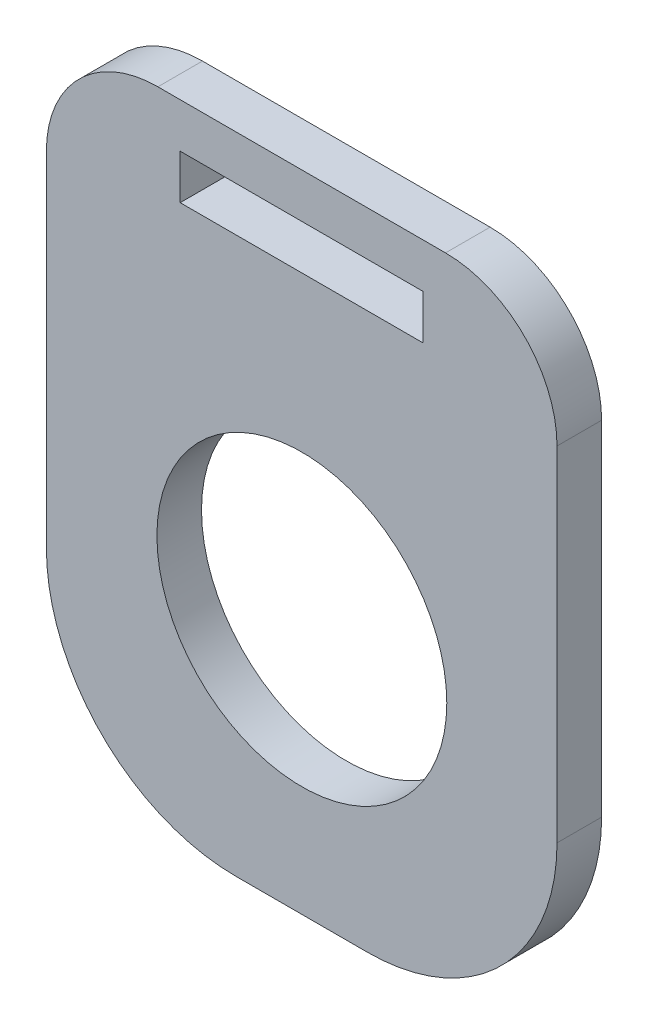
ISO-10303-21;
HEADER;
FILE_DESCRIPTION(('STEP AP214'),'2;1');
FILE_NAME('part.step','',(''),(''),'','','');
FILE_SCHEMA(('AUTOMOTIVE_DESIGN { 1 0 10303 214 1 1 1 1 }'));
ENDSEC;
DATA;
#1=APPLICATION_CONTEXT('core data for automotive mechanical design processes');
#2=APPLICATION_PROTOCOL_DEFINITION('international standard','automotive_design',2000,#1);
#3=PRODUCT_CONTEXT('',#1,'mechanical');
#4=PRODUCT('Part','Part','',(#3));
#5=PRODUCT_RELATED_PRODUCT_CATEGORY('part','',(#4));
#6=PRODUCT_DEFINITION_FORMATION('','',#4);
#7=PRODUCT_DEFINITION_CONTEXT('part definition',#1,'design');
#8=PRODUCT_DEFINITION('design','',#6,#7);
#9=PRODUCT_DEFINITION_SHAPE('','',#8);
#10=(LENGTH_UNIT() NAMED_UNIT(*) SI_UNIT(.MILLI.,.METRE.));
#11=(NAMED_UNIT(*) PLANE_ANGLE_UNIT() SI_UNIT($,.RADIAN.));
#12=(NAMED_UNIT(*) SI_UNIT($,.STERADIAN.) SOLID_ANGLE_UNIT());
#13=UNCERTAINTY_MEASURE_WITH_UNIT(LENGTH_MEASURE(1.E-05),#10,'distance_accuracy_value','');
#14=(GEOMETRIC_REPRESENTATION_CONTEXT(3) GLOBAL_UNCERTAINTY_ASSIGNED_CONTEXT((#13)) GLOBAL_UNIT_ASSIGNED_CONTEXT((#10,
#11,#12)) REPRESENTATION_CONTEXT('',''));
#15=CARTESIAN_POINT('',(0.,0.,0.));
#16=DIRECTION('',(0.,0.,1.));
#17=DIRECTION('',(1.,0.,0.));
#18=AXIS2_PLACEMENT_3D('',#15,#16,#17);
#19=CARTESIAN_POINT('',(0.,0.,5.08));
#20=DIRECTION('',(1.,0.,0.));
#21=DIRECTION('',(0.,0.,-1.));
#22=AXIS2_PLACEMENT_3D('',#19,#20,#21);
#23=PLANE('',#22);
#24=DIRECTION('',(0.,-1.,0.));
#25=VECTOR('',#24,1.);
#26=CARTESIAN_POINT('',(0.,0.,5.08));
#27=LINE('',#26,#25);
#28=CARTESIAN_POINT('',(0.,60.739999932,5.08));
#29=VERTEX_POINT('',#28);
#30=CARTESIAN_POINT('',(0.,21.59,5.08));
#31=VERTEX_POINT('',#30);
#32=EDGE_CURVE('E171',#29,#31,#27,.T.);
#33=ORIENTED_EDGE('',*,*,#32,.F.);
#34=DIRECTION('',(0.,0.,-1.));
#35=VECTOR('',#34,1.);
#36=CARTESIAN_POINT('',(0.,60.739999932,5.08));
#37=LINE('',#36,#35);
#38=CARTESIAN_POINT('',(0.,60.739999932,0.));
#39=VERTEX_POINT('',#38);
#40=EDGE_CURVE('E208',#29,#39,#37,.T.);
#41=ORIENTED_EDGE('',*,*,#40,.T.);
#42=DIRECTION('',(0.,-1.,0.));
#43=VECTOR('',#42,1.);
#44=CARTESIAN_POINT('',(0.,0.,0.));
#45=LINE('',#44,#43);
#46=CARTESIAN_POINT('',(0.,21.59,0.));
#47=VERTEX_POINT('',#46);
#48=EDGE_CURVE('E167',#39,#47,#45,.T.);
#49=ORIENTED_EDGE('',*,*,#48,.T.);
#50=DIRECTION('',(0.,0.,-1.));
#51=VECTOR('',#50,1.);
#52=CARTESIAN_POINT('',(0.,21.59,5.08));
#53=LINE('',#52,#51);
#54=EDGE_CURVE('E205',#47,#31,#53,.F.);
#55=ORIENTED_EDGE('',*,*,#54,.T.);
#56=EDGE_LOOP('',(#33,#41,#49,#55));
#57=FACE_BOUND('',#56,.T.);
#58=ADVANCED_FACE('F33',(#57),#23,.F.);
#59=CARTESIAN_POINT('',(0.,0.,5.08));
#60=DIRECTION('',(0.,1.,0.));
#61=DIRECTION('',(0.,0.,1.));
#62=AXIS2_PLACEMENT_3D('',#59,#60,#61);
#63=PLANE('',#62);
#64=DIRECTION('',(1.,0.,0.));
#65=VECTOR('',#64,1.);
#66=CARTESIAN_POINT('',(0.,0.,0.));
#67=LINE('',#66,#65);
#68=CARTESIAN_POINT('',(21.59,0.,0.));
#69=VERTEX_POINT('',#68);
#70=CARTESIAN_POINT('',(36.576,0.,0.));
#71=VERTEX_POINT('',#70);
#72=EDGE_CURVE('E183',#69,#71,#67,.T.);
#73=ORIENTED_EDGE('',*,*,#72,.T.);
#74=DIRECTION('',(0.,0.,-1.));
#75=VECTOR('',#74,1.);
#76=CARTESIAN_POINT('',(36.576,0.,5.08));
#77=LINE('',#76,#75);
#78=CARTESIAN_POINT('',(36.576,0.,5.08));
#79=VERTEX_POINT('',#78);
#80=EDGE_CURVE('E199',#71,#79,#77,.F.);
#81=ORIENTED_EDGE('',*,*,#80,.T.);
#82=DIRECTION('',(1.,0.,0.));
#83=VECTOR('',#82,1.);
#84=CARTESIAN_POINT('',(0.,0.,5.08));
#85=LINE('',#84,#83);
#86=CARTESIAN_POINT('',(21.59,0.,5.08));
#87=VERTEX_POINT('',#86);
#88=EDGE_CURVE('E173',#87,#79,#85,.T.);
#89=ORIENTED_EDGE('',*,*,#88,.F.);
#90=DIRECTION('',(0.,0.,-1.));
#91=VECTOR('',#90,1.);
#92=CARTESIAN_POINT('',(21.59,0.,5.08));
#93=LINE('',#92,#91);
#94=EDGE_CURVE('E196',#87,#69,#93,.T.);
#95=ORIENTED_EDGE('',*,*,#94,.T.);
#96=EDGE_LOOP('',(#73,#81,#89,#95));
#97=FACE_BOUND('',#96,.T.);
#98=ADVANCED_FACE('F245',(#97),#63,.F.);
#99=CARTESIAN_POINT('',(58.166,0.,5.08));
#100=DIRECTION('',(-1.,0.,0.));
#101=DIRECTION('',(0.,0.,1.));
#102=AXIS2_PLACEMENT_3D('',#99,#100,#101);
#103=PLANE('',#102);
#104=DIRECTION('',(0.,1.,0.));
#105=VECTOR('',#104,1.);
#106=CARTESIAN_POINT('',(58.166,0.,0.));
#107=LINE('',#106,#105);
#108=CARTESIAN_POINT('',(58.166,21.59,0.));
#109=VERTEX_POINT('',#108);
#110=CARTESIAN_POINT('',(58.166,60.739999932,0.));
#111=VERTEX_POINT('',#110);
#112=EDGE_CURVE('E186',#109,#111,#107,.T.);
#113=ORIENTED_EDGE('',*,*,#112,.T.);
#114=DIRECTION('',(0.,0.,-1.));
#115=VECTOR('',#114,1.);
#116=CARTESIAN_POINT('',(58.166,60.739999932,5.08));
#117=LINE('',#116,#115);
#118=CARTESIAN_POINT('',(58.166,60.739999932,5.08));
#119=VERTEX_POINT('',#118);
#120=EDGE_CURVE('E11',#111,#119,#117,.F.);
#121=ORIENTED_EDGE('',*,*,#120,.T.);
#122=DIRECTION('',(0.,1.,0.));
#123=VECTOR('',#122,1.);
#124=CARTESIAN_POINT('',(58.166,0.,5.08));
#125=LINE('',#124,#123);
#126=CARTESIAN_POINT('',(58.166,21.59,5.08));
#127=VERTEX_POINT('',#126);
#128=EDGE_CURVE('E177',#127,#119,#125,.T.);
#129=ORIENTED_EDGE('',*,*,#128,.F.);
#130=DIRECTION('',(0.,0.,-1.));
#131=VECTOR('',#130,1.);
#132=CARTESIAN_POINT('',(58.166,21.59,5.08));
#133=LINE('',#132,#131);
#134=EDGE_CURVE('E181',#127,#109,#133,.T.);
#135=ORIENTED_EDGE('',*,*,#134,.T.);
#136=EDGE_LOOP('',(#113,#121,#129,#135));
#137=FACE_BOUND('',#136,.T.);
#138=ADVANCED_FACE('F237',(#137),#103,.F.);
#139=CARTESIAN_POINT('',(0.,73.439999932,5.08));
#140=DIRECTION('',(0.,-1.,0.));
#141=DIRECTION('',(0.,0.,-1.));
#142=AXIS2_PLACEMENT_3D('',#139,#140,#141);
#143=PLANE('',#142);
#144=DIRECTION('',(-1.,0.,0.));
#145=VECTOR('',#144,1.);
#146=CARTESIAN_POINT('',(0.,73.439999932,0.));
#147=LINE('',#146,#145);
#148=CARTESIAN_POINT('',(45.466,73.439999932,0.));
#149=VERTEX_POINT('',#148);
#150=CARTESIAN_POINT('',(12.7,73.439999932,0.));
#151=VERTEX_POINT('',#150);
#152=EDGE_CURVE('E174',#149,#151,#147,.T.);
#153=ORIENTED_EDGE('',*,*,#152,.T.);
#154=DIRECTION('',(0.,0.,-1.));
#155=VECTOR('',#154,1.);
#156=CARTESIAN_POINT('',(12.7,73.439999932,5.08));
#157=LINE('',#156,#155);
#158=CARTESIAN_POINT('',(12.7,73.439999932,5.08));
#159=VERTEX_POINT('',#158);
#160=EDGE_CURVE('E54',#151,#159,#157,.F.);
#161=ORIENTED_EDGE('',*,*,#160,.T.);
#162=DIRECTION('',(-1.,0.,0.));
#163=VECTOR('',#162,1.);
#164=CARTESIAN_POINT('',(0.,73.439999932,5.08));
#165=LINE('',#164,#163);
#166=CARTESIAN_POINT('',(45.466,73.439999932,5.08));
#167=VERTEX_POINT('',#166);
#168=EDGE_CURVE('E179',#167,#159,#165,.T.);
#169=ORIENTED_EDGE('',*,*,#168,.F.);
#170=DIRECTION('',(0.,0.,-1.));
#171=VECTOR('',#170,1.);
#172=CARTESIAN_POINT('',(45.466,73.439999932,5.08));
#173=LINE('',#172,#171);
#174=EDGE_CURVE('E215',#167,#149,#173,.T.);
#175=ORIENTED_EDGE('',*,*,#174,.T.);
#176=EDGE_LOOP('',(#153,#161,#169,#175));
#177=FACE_BOUND('',#176,.T.);
#178=ADVANCED_FACE('F232',(#177),#143,.F.);
#179=CARTESIAN_POINT('',(0.,0.,5.08));
#180=DIRECTION('',(0.,0.,-1.));
#181=DIRECTION('',(-1.,0.,0.));
#182=AXIS2_PLACEMENT_3D('',#179,#180,#181);
#183=PLANE('',#182);
#184=CARTESIAN_POINT('',(29.099999966,29.1,5.08));
#185=DIRECTION('',(0.,0.,-1.));
#186=DIRECTION('',(-1.,0.,0.));
#187=AXIS2_PLACEMENT_3D('',#184,#185,#186);
#188=CIRCLE('',#187,16.51);
#189=CARTESIAN_POINT('',(12.589999966,29.1,5.08));
#190=VERTEX_POINT('',#189);
#191=EDGE_CURVE('E155',#190,#190,#188,.T.);
#192=ORIENTED_EDGE('',*,*,#191,.T.);
#193=EDGE_LOOP('',(#192));
#194=FACE_BOUND('',#193,.T.);
#195=DIRECTION('',(1.,0.,0.));
#196=VECTOR('',#195,1.);
#197=CARTESIAN_POINT('',(15.24,63.279999932,5.08));
#198=LINE('',#197,#196);
#199=CARTESIAN_POINT('',(15.24,63.279999932,5.08));
#200=VERTEX_POINT('',#199);
#201=CARTESIAN_POINT('',(42.926,63.279999932,5.08));
#202=VERTEX_POINT('',#201);
#203=EDGE_CURVE('E161',#200,#202,#198,.T.);
#204=ORIENTED_EDGE('',*,*,#203,.F.);
#205=DIRECTION('',(0.,-1.,0.));
#206=VECTOR('',#205,1.);
#207=CARTESIAN_POINT('',(15.24,68.359999932,5.08));
#208=LINE('',#207,#206);
#209=CARTESIAN_POINT('',(15.24,68.359999932,5.08));
#210=VERTEX_POINT('',#209);
#211=EDGE_CURVE('E131',#210,#200,#208,.T.);
#212=ORIENTED_EDGE('',*,*,#211,.F.);
#213=DIRECTION('',(-1.,0.,0.));
#214=VECTOR('',#213,1.);
#215=CARTESIAN_POINT('',(15.24,68.359999932,5.08));
#216=LINE('',#215,#214);
#217=CARTESIAN_POINT('',(42.926,68.359999932,5.08));
#218=VERTEX_POINT('',#217);
#219=EDGE_CURVE('E149',#218,#210,#216,.T.);
#220=ORIENTED_EDGE('',*,*,#219,.F.);
#221=DIRECTION('',(0.,1.,0.));
#222=VECTOR('',#221,1.);
#223=CARTESIAN_POINT('',(42.926,68.359999932,5.08));
#224=LINE('',#223,#222);
#225=EDGE_CURVE('E152',#202,#218,#224,.T.);
#226=ORIENTED_EDGE('',*,*,#225,.F.);
#227=EDGE_LOOP('',(#204,#212,#220,#226));
#228=FACE_BOUND('',#227,.T.);
#229=ORIENTED_EDGE('',*,*,#168,.T.);
#230=CARTESIAN_POINT('',(12.7,60.739999932,5.08));
#231=DIRECTION('',(0.,0.,-1.));
#232=DIRECTION('',(-1.,0.,0.));
#233=AXIS2_PLACEMENT_3D('',#230,#231,#232);
#234=CIRCLE('',#233,12.7);
#235=EDGE_CURVE('E41',#159,#29,#234,.F.);
#236=ORIENTED_EDGE('',*,*,#235,.T.);
#237=ORIENTED_EDGE('',*,*,#32,.T.);
#238=CARTESIAN_POINT('',(21.59,21.59,5.08));
#239=DIRECTION('',(0.,0.,-1.));
#240=DIRECTION('',(-1.,0.,0.));
#241=AXIS2_PLACEMENT_3D('',#238,#239,#240);
#242=CIRCLE('',#241,21.59);
#243=EDGE_CURVE('E201',#31,#87,#242,.F.);
#244=ORIENTED_EDGE('',*,*,#243,.T.);
#245=ORIENTED_EDGE('',*,*,#88,.T.);
#246=CARTESIAN_POINT('',(36.576,21.59,5.08));
#247=DIRECTION('',(0.,0.,-1.));
#248=DIRECTION('',(-1.,0.,0.));
#249=AXIS2_PLACEMENT_3D('',#246,#247,#248);
#250=CIRCLE('',#249,21.59);
#251=EDGE_CURVE('E203',#79,#127,#250,.F.);
#252=ORIENTED_EDGE('',*,*,#251,.T.);
#253=ORIENTED_EDGE('',*,*,#128,.T.);
#254=CARTESIAN_POINT('',(45.466,60.739999932,5.08));
#255=DIRECTION('',(0.,0.,-1.));
#256=DIRECTION('',(-1.,0.,0.));
#257=AXIS2_PLACEMENT_3D('',#254,#255,#256);
#258=CIRCLE('',#257,12.7);
#259=EDGE_CURVE('E219',#119,#167,#258,.F.);
#260=ORIENTED_EDGE('',*,*,#259,.T.);
#261=EDGE_LOOP('',(#229,#236,#237,#244,#245,#252,#253,#260));
#262=FACE_BOUND('',#261,.T.);
#263=ADVANCED_FACE('F223',(#194,#228,#262),#183,.F.);
#264=CARTESIAN_POINT('',(0.,0.,0.));
#265=DIRECTION('',(0.,0.,-1.));
#266=DIRECTION('',(-1.,0.,0.));
#267=AXIS2_PLACEMENT_3D('',#264,#265,#266);
#268=PLANE('',#267);
#269=CARTESIAN_POINT('',(29.099999966,29.1,0.));
#270=DIRECTION('',(0.,0.,1.));
#271=DIRECTION('',(1.,0.,0.));
#272=AXIS2_PLACEMENT_3D('',#269,#270,#271);
#273=CIRCLE('',#272,16.51);
#274=CARTESIAN_POINT('',(45.609999966,29.1,0.));
#275=VERTEX_POINT('',#274);
#276=EDGE_CURVE('E294',#275,#275,#273,.T.);
#277=ORIENTED_EDGE('',*,*,#276,.T.);
#278=EDGE_LOOP('',(#277));
#279=FACE_BOUND('',#278,.T.);
#280=DIRECTION('',(0.,-1.,0.));
#281=VECTOR('',#280,1.);
#282=CARTESIAN_POINT('',(15.24,68.359999932,0.));
#283=LINE('',#282,#281);
#284=CARTESIAN_POINT('',(15.24,68.359999932,0.));
#285=VERTEX_POINT('',#284);
#286=CARTESIAN_POINT('',(15.24,63.279999932,0.));
#287=VERTEX_POINT('',#286);
#288=EDGE_CURVE('E128',#285,#287,#283,.T.);
#289=ORIENTED_EDGE('',*,*,#288,.T.);
#290=DIRECTION('',(1.,0.,0.));
#291=VECTOR('',#290,1.);
#292=CARTESIAN_POINT('',(15.24,63.279999932,0.));
#293=LINE('',#292,#291);
#294=CARTESIAN_POINT('',(42.926,63.279999932,0.));
#295=VERTEX_POINT('',#294);
#296=EDGE_CURVE('E140',#287,#295,#293,.T.);
#297=ORIENTED_EDGE('',*,*,#296,.T.);
#298=DIRECTION('',(0.,1.,0.));
#299=VECTOR('',#298,1.);
#300=CARTESIAN_POINT('',(42.926,68.359999932,0.));
#301=LINE('',#300,#299);
#302=CARTESIAN_POINT('',(42.926,68.359999932,0.));
#303=VERTEX_POINT('',#302);
#304=EDGE_CURVE('E144',#295,#303,#301,.T.);
#305=ORIENTED_EDGE('',*,*,#304,.T.);
#306=DIRECTION('',(-1.,0.,0.));
#307=VECTOR('',#306,1.);
#308=CARTESIAN_POINT('',(15.24,68.359999932,0.));
#309=LINE('',#308,#307);
#310=EDGE_CURVE('E136',#303,#285,#309,.T.);
#311=ORIENTED_EDGE('',*,*,#310,.T.);
#312=EDGE_LOOP('',(#289,#297,#305,#311));
#313=FACE_BOUND('',#312,.T.);
#314=ORIENTED_EDGE('',*,*,#48,.F.);
#315=CARTESIAN_POINT('',(12.7,60.739999932,0.));
#316=DIRECTION('',(0.,0.,-1.));
#317=DIRECTION('',(-1.,0.,0.));
#318=AXIS2_PLACEMENT_3D('',#315,#316,#317);
#319=CIRCLE('',#318,12.7);
#320=EDGE_CURVE('E213',#39,#151,#319,.T.);
#321=ORIENTED_EDGE('',*,*,#320,.T.);
#322=ORIENTED_EDGE('',*,*,#152,.F.);
#323=CARTESIAN_POINT('',(45.466,60.739999932,0.));
#324=DIRECTION('',(0.,0.,-1.));
#325=DIRECTION('',(-1.,0.,0.));
#326=AXIS2_PLACEMENT_3D('',#323,#324,#325);
#327=CIRCLE('',#326,12.7);
#328=EDGE_CURVE('E211',#149,#111,#327,.T.);
#329=ORIENTED_EDGE('',*,*,#328,.T.);
#330=ORIENTED_EDGE('',*,*,#112,.F.);
#331=CARTESIAN_POINT('',(36.576,21.59,0.));
#332=DIRECTION('',(0.,0.,-1.));
#333=DIRECTION('',(-1.,0.,0.));
#334=AXIS2_PLACEMENT_3D('',#331,#332,#333);
#335=CIRCLE('',#334,21.59);
#336=EDGE_CURVE('E194',#109,#71,#335,.T.);
#337=ORIENTED_EDGE('',*,*,#336,.T.);
#338=ORIENTED_EDGE('',*,*,#72,.F.);
#339=CARTESIAN_POINT('',(21.59,21.59,0.));
#340=DIRECTION('',(0.,0.,-1.));
#341=DIRECTION('',(-1.,0.,0.));
#342=AXIS2_PLACEMENT_3D('',#339,#340,#341);
#343=CIRCLE('',#342,21.59);
#344=EDGE_CURVE('E191',#69,#47,#343,.T.);
#345=ORIENTED_EDGE('',*,*,#344,.T.);
#346=EDGE_LOOP('',(#314,#321,#322,#329,#330,#337,#338,#345));
#347=FACE_BOUND('',#346,.T.);
#348=ADVANCED_FACE('F146',(#279,#313,#347),#268,.T.);
#349=CARTESIAN_POINT('',(15.24,68.359999932,0.));
#350=DIRECTION('',(-1.,0.,0.));
#351=DIRECTION('',(0.,0.,1.));
#352=AXIS2_PLACEMENT_3D('',#349,#350,#351);
#353=PLANE('',#352);
#354=ORIENTED_EDGE('',*,*,#211,.T.);
#355=DIRECTION('',(0.,0.,1.));
#356=VECTOR('',#355,1.);
#357=CARTESIAN_POINT('',(15.24,63.279999932,0.));
#358=LINE('',#357,#356);
#359=EDGE_CURVE('E124',#287,#200,#358,.T.);
#360=ORIENTED_EDGE('',*,*,#359,.F.);
#361=ORIENTED_EDGE('',*,*,#288,.F.);
#362=DIRECTION('',(0.,0.,1.));
#363=VECTOR('',#362,1.);
#364=CARTESIAN_POINT('',(15.24,68.359999932,0.));
#365=LINE('',#364,#363);
#366=EDGE_CURVE('E165',#285,#210,#365,.T.);
#367=ORIENTED_EDGE('',*,*,#366,.T.);
#368=EDGE_LOOP('',(#354,#360,#361,#367));
#369=FACE_BOUND('',#368,.T.);
#370=ADVANCED_FACE('F126',(#369),#353,.F.);
#371=CARTESIAN_POINT('',(15.24,68.359999932,0.));
#372=DIRECTION('',(0.,1.,0.));
#373=DIRECTION('',(-1.,0.,0.));
#374=AXIS2_PLACEMENT_3D('',#371,#372,#373);
#375=PLANE('',#374);
#376=ORIENTED_EDGE('',*,*,#219,.T.);
#377=ORIENTED_EDGE('',*,*,#366,.F.);
#378=ORIENTED_EDGE('',*,*,#310,.F.);
#379=DIRECTION('',(0.,0.,1.));
#380=VECTOR('',#379,1.);
#381=CARTESIAN_POINT('',(42.926,68.359999932,0.));
#382=LINE('',#381,#380);
#383=EDGE_CURVE('E168',#303,#218,#382,.T.);
#384=ORIENTED_EDGE('',*,*,#383,.T.);
#385=EDGE_LOOP('',(#376,#377,#378,#384));
#386=FACE_BOUND('',#385,.T.);
#387=ADVANCED_FACE('F277',(#386),#375,.F.);
#388=CARTESIAN_POINT('',(42.926,68.359999932,0.));
#389=DIRECTION('',(1.,0.,0.));
#390=DIRECTION('',(0.,0.,-1.));
#391=AXIS2_PLACEMENT_3D('',#388,#389,#390);
#392=PLANE('',#391);
#393=ORIENTED_EDGE('',*,*,#225,.T.);
#394=ORIENTED_EDGE('',*,*,#383,.F.);
#395=ORIENTED_EDGE('',*,*,#304,.F.);
#396=DIRECTION('',(0.,0.,1.));
#397=VECTOR('',#396,1.);
#398=CARTESIAN_POINT('',(42.926,63.279999932,0.));
#399=LINE('',#398,#397);
#400=EDGE_CURVE('E135',#295,#202,#399,.T.);
#401=ORIENTED_EDGE('',*,*,#400,.T.);
#402=EDGE_LOOP('',(#393,#394,#395,#401));
#403=FACE_BOUND('',#402,.T.);
#404=ADVANCED_FACE('F280',(#403),#392,.F.);
#405=CARTESIAN_POINT('',(15.24,63.279999932,0.));
#406=DIRECTION('',(0.,-1.,0.));
#407=DIRECTION('',(1.,0.,0.));
#408=AXIS2_PLACEMENT_3D('',#405,#406,#407);
#409=PLANE('',#408);
#410=ORIENTED_EDGE('',*,*,#203,.T.);
#411=ORIENTED_EDGE('',*,*,#400,.F.);
#412=ORIENTED_EDGE('',*,*,#296,.F.);
#413=ORIENTED_EDGE('',*,*,#359,.T.);
#414=EDGE_LOOP('',(#410,#411,#412,#413));
#415=FACE_BOUND('',#414,.T.);
#416=ADVANCED_FACE('F141',(#415),#409,.F.);
#417=CARTESIAN_POINT('',(29.099999966,29.1,0.));
#418=DIRECTION('',(0.,0.,1.));
#419=DIRECTION('',(1.,0.,0.));
#420=AXIS2_PLACEMENT_3D('',#417,#418,#419);
#421=CYLINDRICAL_SURFACE('',#420,16.51);
#422=ORIENTED_EDGE('',*,*,#276,.F.);
#423=EDGE_LOOP('',(#422));
#424=FACE_BOUND('',#423,.T.);
#425=ORIENTED_EDGE('',*,*,#191,.F.);
#426=EDGE_LOOP('',(#425));
#427=FACE_BOUND('',#426,.T.);
#428=ADVANCED_FACE('F256',(#424,#427),#421,.F.);
#429=CARTESIAN_POINT('',(36.576,21.59,5.08));
#430=DIRECTION('',(0.,0.,-1.));
#431=DIRECTION('',(-1.,0.,0.));
#432=AXIS2_PLACEMENT_3D('',#429,#430,#431);
#433=CYLINDRICAL_SURFACE('',#432,21.59);
#434=ORIENTED_EDGE('',*,*,#251,.F.);
#435=ORIENTED_EDGE('',*,*,#80,.F.);
#436=ORIENTED_EDGE('',*,*,#336,.F.);
#437=ORIENTED_EDGE('',*,*,#134,.F.);
#438=EDGE_LOOP('',(#434,#435,#436,#437));
#439=FACE_BOUND('',#438,.T.);
#440=ADVANCED_FACE('F241',(#439),#433,.T.);
#441=CARTESIAN_POINT('',(21.59,21.59,5.08));
#442=DIRECTION('',(0.,0.,-1.));
#443=DIRECTION('',(-1.,0.,0.));
#444=AXIS2_PLACEMENT_3D('',#441,#442,#443);
#445=CYLINDRICAL_SURFACE('',#444,21.59);
#446=ORIENTED_EDGE('',*,*,#243,.F.);
#447=ORIENTED_EDGE('',*,*,#54,.F.);
#448=ORIENTED_EDGE('',*,*,#344,.F.);
#449=ORIENTED_EDGE('',*,*,#94,.F.);
#450=EDGE_LOOP('',(#446,#447,#448,#449));
#451=FACE_BOUND('',#450,.T.);
#452=ADVANCED_FACE('F249',(#451),#445,.T.);
#453=CARTESIAN_POINT('',(12.7,60.739999932,5.08));
#454=DIRECTION('',(0.,0.,-1.));
#455=DIRECTION('',(-1.,0.,0.));
#456=AXIS2_PLACEMENT_3D('',#453,#454,#455);
#457=CYLINDRICAL_SURFACE('',#456,12.7);
#458=ORIENTED_EDGE('',*,*,#235,.F.);
#459=ORIENTED_EDGE('',*,*,#160,.F.);
#460=ORIENTED_EDGE('',*,*,#320,.F.);
#461=ORIENTED_EDGE('',*,*,#40,.F.);
#462=EDGE_LOOP('',(#458,#459,#460,#461));
#463=FACE_BOUND('',#462,.T.);
#464=ADVANCED_FACE('F230',(#463),#457,.T.);
#465=CARTESIAN_POINT('',(45.466,60.739999932,5.08));
#466=DIRECTION('',(0.,0.,-1.));
#467=DIRECTION('',(-1.,0.,0.));
#468=AXIS2_PLACEMENT_3D('',#465,#466,#467);
#469=CYLINDRICAL_SURFACE('',#468,12.7);
#470=ORIENTED_EDGE('',*,*,#259,.F.);
#471=ORIENTED_EDGE('',*,*,#120,.F.);
#472=ORIENTED_EDGE('',*,*,#328,.F.);
#473=ORIENTED_EDGE('',*,*,#174,.F.);
#474=EDGE_LOOP('',(#470,#471,#472,#473));
#475=FACE_BOUND('',#474,.T.);
#476=ADVANCED_FACE('F35',(#475),#469,.T.);
#477=CLOSED_SHELL('',(#58,#98,#138,#178,#263,#348,#370,#387,#404,#416,#428,#440,#452,#464,#476));
#478=MANIFOLD_SOLID_BREP('B2',#477);
#479=ADVANCED_BREP_SHAPE_REPRESENTATION('',(#18,#478),#14);
#480=SHAPE_DEFINITION_REPRESENTATION(#9,#479);
ENDSEC;
END-ISO-10303-21;
